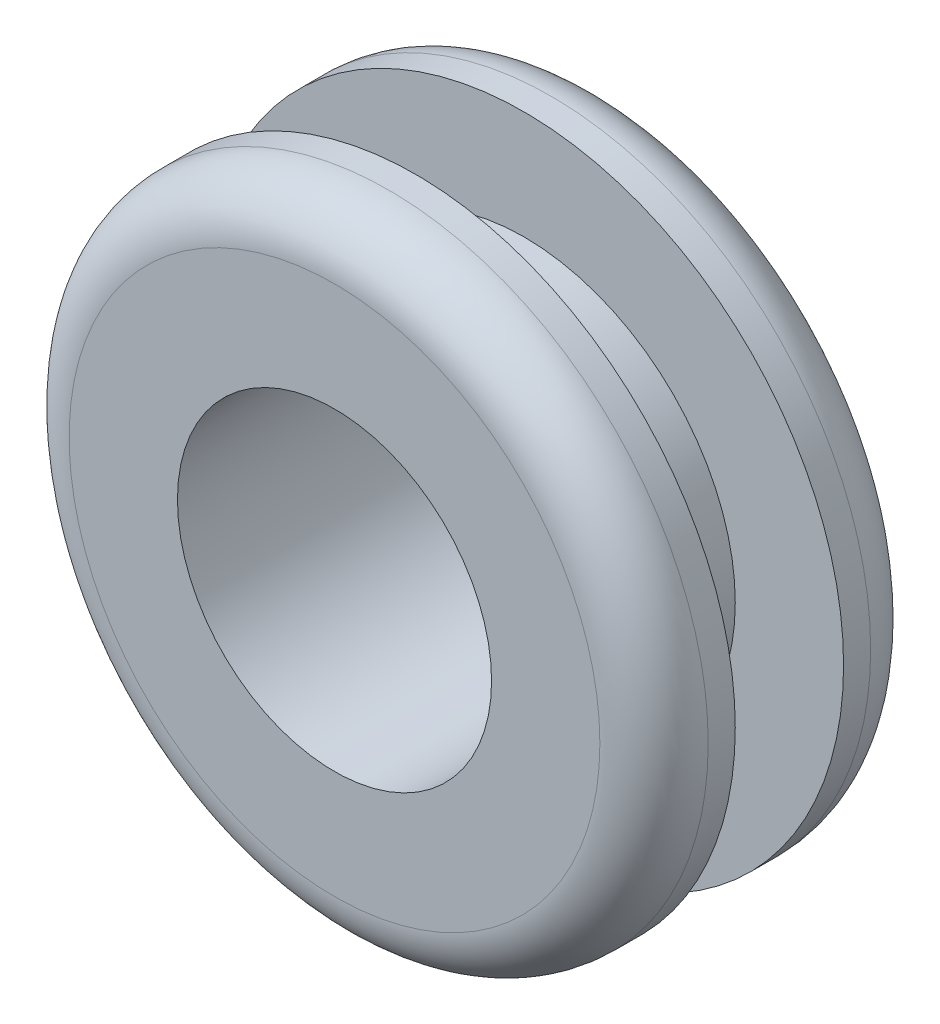
ISO-10303-21;
HEADER;
FILE_DESCRIPTION(('STEP AP214'),'2;1');
FILE_NAME('part.step','',(''),(''),'','','');
FILE_SCHEMA(('AUTOMOTIVE_DESIGN { 1 0 10303 214 1 1 1 1 }'));
ENDSEC;
DATA;
#1=APPLICATION_CONTEXT('core data for automotive mechanical design processes');
#2=APPLICATION_PROTOCOL_DEFINITION('international standard','automotive_design',2000,#1);
#3=PRODUCT_CONTEXT('',#1,'mechanical');
#4=PRODUCT('Part','Part','',(#3));
#5=PRODUCT_RELATED_PRODUCT_CATEGORY('part','',(#4));
#6=PRODUCT_DEFINITION_FORMATION('','',#4);
#7=PRODUCT_DEFINITION_CONTEXT('part definition',#1,'design');
#8=PRODUCT_DEFINITION('design','',#6,#7);
#9=PRODUCT_DEFINITION_SHAPE('','',#8);
#10=(LENGTH_UNIT() NAMED_UNIT(*) SI_UNIT(.MILLI.,.METRE.));
#11=(NAMED_UNIT(*) PLANE_ANGLE_UNIT() SI_UNIT($,.RADIAN.));
#12=(NAMED_UNIT(*) SI_UNIT($,.STERADIAN.) SOLID_ANGLE_UNIT());
#13=UNCERTAINTY_MEASURE_WITH_UNIT(LENGTH_MEASURE(1.E-05),#10,'distance_accuracy_value','');
#14=(GEOMETRIC_REPRESENTATION_CONTEXT(3) GLOBAL_UNCERTAINTY_ASSIGNED_CONTEXT((#13)) GLOBAL_UNIT_ASSIGNED_CONTEXT((#10,
#11,#12)) REPRESENTATION_CONTEXT('',''));
#15=CARTESIAN_POINT('',(0.,0.,0.));
#16=DIRECTION('',(0.,0.,1.));
#17=DIRECTION('',(1.,0.,0.));
#18=AXIS2_PLACEMENT_3D('',#15,#16,#17);
#19=CARTESIAN_POINT('',(-4.9,0.,2.50000000000001));
#20=DIRECTION('',(0.,0.,-1.));
#21=DIRECTION('',(-1.,0.,0.));
#22=AXIS2_PLACEMENT_3D('',#19,#20,#21);
#23=PLANE('',#22);
#24=CARTESIAN_POINT('',(0.,0.,2.50000000000001));
#25=DIRECTION('',(0.,0.,1.));
#26=DIRECTION('',(1.,0.,0.));
#27=AXIS2_PLACEMENT_3D('',#24,#25,#26);
#28=CIRCLE('',#27,2.89999999999999);
#29=CARTESIAN_POINT('',(2.89999999999999,0.,2.50000000000001));
#30=VERTEX_POINT('',#29);
#31=EDGE_CURVE('E10',#30,#30,#28,.T.);
#32=ORIENTED_EDGE('',*,*,#31,.F.);
#33=EDGE_LOOP('',(#32));
#34=FACE_BOUND('',#33,.T.);
#35=CARTESIAN_POINT('',(0.,0.,2.50000000000001));
#36=DIRECTION('',(0.,0.,1.));
#37=DIRECTION('',(1.,0.,0.));
#38=AXIS2_PLACEMENT_3D('',#35,#36,#37);
#39=CIRCLE('',#38,4.9);
#40=CARTESIAN_POINT('',(4.9,0.,2.50000000000001));
#41=VERTEX_POINT('',#40);
#42=EDGE_CURVE('E80',#41,#41,#39,.T.);
#43=ORIENTED_EDGE('',*,*,#42,.T.);
#44=EDGE_LOOP('',(#43));
#45=FACE_BOUND('',#44,.T.);
#46=ADVANCED_FACE('F37',(#34,#45),#23,.F.);
#47=CARTESIAN_POINT('',(0.,0.,0.));
#48=DIRECTION('',(0.,0.,1.));
#49=DIRECTION('',(1.,0.,0.));
#50=AXIS2_PLACEMENT_3D('',#47,#48,#49);
#51=CYLINDRICAL_SURFACE('',#50,2.9);
#52=CARTESIAN_POINT('',(0.,0.,-2.49999999999999));
#53=DIRECTION('',(0.,0.,1.));
#54=DIRECTION('',(1.,0.,0.));
#55=AXIS2_PLACEMENT_3D('',#52,#53,#54);
#56=CIRCLE('',#55,2.90000000000001);
#57=CARTESIAN_POINT('',(2.90000000000001,0.,-2.49999999999999));
#58=VERTEX_POINT('',#57);
#59=EDGE_CURVE('E44',#58,#58,#56,.T.);
#60=ORIENTED_EDGE('',*,*,#59,.F.);
#61=EDGE_LOOP('',(#60));
#62=FACE_BOUND('',#61,.T.);
#63=ORIENTED_EDGE('',*,*,#31,.T.);
#64=EDGE_LOOP('',(#63));
#65=FACE_BOUND('',#64,.T.);
#66=ADVANCED_FACE('F130',(#62,#65),#51,.F.);
#67=CARTESIAN_POINT('',(-2.90000000000001,0.,-2.5));
#68=DIRECTION('',(0.,0.,1.));
#69=DIRECTION('',(1.,0.,0.));
#70=AXIS2_PLACEMENT_3D('',#67,#68,#69);
#71=PLANE('',#70);
#72=CARTESIAN_POINT('',(0.,0.,-2.5));
#73=DIRECTION('',(0.,0.,1.));
#74=DIRECTION('',(1.,0.,0.));
#75=AXIS2_PLACEMENT_3D('',#72,#73,#74);
#76=CIRCLE('',#75,4.9);
#77=CARTESIAN_POINT('',(4.9,0.,-2.5));
#78=VERTEX_POINT('',#77);
#79=EDGE_CURVE('E49',#78,#78,#76,.T.);
#80=ORIENTED_EDGE('',*,*,#79,.F.);
#81=EDGE_LOOP('',(#80));
#82=FACE_BOUND('',#81,.T.);
#83=ORIENTED_EDGE('',*,*,#59,.T.);
#84=EDGE_LOOP('',(#83));
#85=FACE_BOUND('',#84,.T.);
#86=ADVANCED_FACE('F125',(#82,#85),#71,.F.);
#87=CARTESIAN_POINT('',(0.,0.,-1.49999999999998));
#88=DIRECTION('',(0.,0.,1.));
#89=DIRECTION('',(1.,0.,0.));
#90=AXIS2_PLACEMENT_3D('',#87,#88,#89);
#91=TOROIDAL_SURFACE('',#90,4.90000000000001,1.);
#92=CARTESIAN_POINT('',(0.,0.,-1.5));
#93=DIRECTION('',(0.,0.,1.));
#94=DIRECTION('',(1.,0.,0.));
#95=AXIS2_PLACEMENT_3D('',#92,#93,#94);
#96=CIRCLE('',#95,5.90000000000001);
#97=CARTESIAN_POINT('',(5.90000000000001,0.,-1.5));
#98=VERTEX_POINT('',#97);
#99=EDGE_CURVE('E54',#98,#98,#96,.T.);
#100=ORIENTED_EDGE('',*,*,#99,.F.);
#101=EDGE_LOOP('',(#100));
#102=FACE_BOUND('',#101,.T.);
#103=ORIENTED_EDGE('',*,*,#79,.T.);
#104=EDGE_LOOP('',(#103));
#105=FACE_BOUND('',#104,.T.);
#106=ADVANCED_FACE('F119',(#102,#105),#91,.T.);
#107=CARTESIAN_POINT('',(0.,0.,0.));
#108=DIRECTION('',(0.,0.,1.));
#109=DIRECTION('',(1.,0.,0.));
#110=AXIS2_PLACEMENT_3D('',#107,#108,#109);
#111=CYLINDRICAL_SURFACE('',#110,5.9);
#112=CARTESIAN_POINT('',(0.,0.,-0.999999999999979));
#113=DIRECTION('',(0.,0.,1.));
#114=DIRECTION('',(1.,0.,0.));
#115=AXIS2_PLACEMENT_3D('',#112,#113,#114);
#116=CIRCLE('',#115,5.9);
#117=CARTESIAN_POINT('',(5.9,0.,-0.999999999999979));
#118=VERTEX_POINT('',#117);
#119=EDGE_CURVE('E60',#118,#118,#116,.T.);
#120=ORIENTED_EDGE('',*,*,#119,.F.);
#121=EDGE_LOOP('',(#120));
#122=FACE_BOUND('',#121,.T.);
#123=ORIENTED_EDGE('',*,*,#99,.T.);
#124=EDGE_LOOP('',(#123));
#125=FACE_BOUND('',#124,.T.);
#126=ADVANCED_FACE('F113',(#122,#125),#111,.T.);
#127=CARTESIAN_POINT('',(-5.9,0.,-0.999999999999983));
#128=DIRECTION('',(0.,0.,-1.));
#129=DIRECTION('',(-1.,0.,0.));
#130=AXIS2_PLACEMENT_3D('',#127,#128,#129);
#131=PLANE('',#130);
#132=CARTESIAN_POINT('',(0.,0.,-0.999999999999986));
#133=DIRECTION('',(0.,0.,1.));
#134=DIRECTION('',(1.,0.,0.));
#135=AXIS2_PLACEMENT_3D('',#132,#133,#134);
#136=CIRCLE('',#135,3.90000000000001);
#137=CARTESIAN_POINT('',(3.90000000000001,0.,-0.999999999999986));
#138=VERTEX_POINT('',#137);
#139=EDGE_CURVE('E64',#138,#138,#136,.T.);
#140=ORIENTED_EDGE('',*,*,#139,.F.);
#141=EDGE_LOOP('',(#140));
#142=FACE_BOUND('',#141,.T.);
#143=ORIENTED_EDGE('',*,*,#119,.T.);
#144=EDGE_LOOP('',(#143));
#145=FACE_BOUND('',#144,.T.);
#146=ADVANCED_FACE('F107',(#142,#145),#131,.F.);
#147=CARTESIAN_POINT('',(0.,0.,0.));
#148=DIRECTION('',(0.,0.,1.));
#149=DIRECTION('',(1.,0.,0.));
#150=AXIS2_PLACEMENT_3D('',#147,#148,#149);
#151=CYLINDRICAL_SURFACE('',#150,3.9);
#152=CARTESIAN_POINT('',(0.,0.,1.00000000000001));
#153=DIRECTION('',(0.,0.,1.));
#154=DIRECTION('',(1.,0.,0.));
#155=AXIS2_PLACEMENT_3D('',#152,#153,#154);
#156=CIRCLE('',#155,3.9);
#157=CARTESIAN_POINT('',(3.9,0.,1.00000000000001));
#158=VERTEX_POINT('',#157);
#159=EDGE_CURVE('E68',#158,#158,#156,.T.);
#160=ORIENTED_EDGE('',*,*,#159,.F.);
#161=EDGE_LOOP('',(#160));
#162=FACE_BOUND('',#161,.T.);
#163=ORIENTED_EDGE('',*,*,#139,.T.);
#164=EDGE_LOOP('',(#163));
#165=FACE_BOUND('',#164,.T.);
#166=ADVANCED_FACE('F101',(#162,#165),#151,.T.);
#167=CARTESIAN_POINT('',(-3.9,0.,1.00000000000001));
#168=DIRECTION('',(0.,0.,1.));
#169=DIRECTION('',(1.,0.,0.));
#170=AXIS2_PLACEMENT_3D('',#167,#168,#169);
#171=PLANE('',#170);
#172=CARTESIAN_POINT('',(0.,0.,1.00000000000001));
#173=DIRECTION('',(0.,0.,1.));
#174=DIRECTION('',(1.,0.,0.));
#175=AXIS2_PLACEMENT_3D('',#172,#173,#174);
#176=CIRCLE('',#175,5.9);
#177=CARTESIAN_POINT('',(5.9,0.,1.00000000000001));
#178=VERTEX_POINT('',#177);
#179=EDGE_CURVE('E72',#178,#178,#176,.T.);
#180=ORIENTED_EDGE('',*,*,#179,.F.);
#181=EDGE_LOOP('',(#180));
#182=FACE_BOUND('',#181,.T.);
#183=ORIENTED_EDGE('',*,*,#159,.T.);
#184=EDGE_LOOP('',(#183));
#185=FACE_BOUND('',#184,.T.);
#186=ADVANCED_FACE('F95',(#182,#185),#171,.F.);
#187=CARTESIAN_POINT('',(0.,0.,0.));
#188=DIRECTION('',(0.,0.,1.));
#189=DIRECTION('',(1.,0.,0.));
#190=AXIS2_PLACEMENT_3D('',#187,#188,#189);
#191=CYLINDRICAL_SURFACE('',#190,5.9);
#192=CARTESIAN_POINT('',(0.,0.,1.5));
#193=DIRECTION('',(0.,0.,1.));
#194=DIRECTION('',(1.,0.,0.));
#195=AXIS2_PLACEMENT_3D('',#192,#193,#194);
#196=CIRCLE('',#195,5.9);
#197=CARTESIAN_POINT('',(5.9,0.,1.5));
#198=VERTEX_POINT('',#197);
#199=EDGE_CURVE('E76',#198,#198,#196,.T.);
#200=ORIENTED_EDGE('',*,*,#199,.F.);
#201=EDGE_LOOP('',(#200));
#202=FACE_BOUND('',#201,.T.);
#203=ORIENTED_EDGE('',*,*,#179,.T.);
#204=EDGE_LOOP('',(#203));
#205=FACE_BOUND('',#204,.T.);
#206=ADVANCED_FACE('F89',(#202,#205),#191,.T.);
#207=CARTESIAN_POINT('',(0.,0.,1.50000000000002));
#208=DIRECTION('',(0.,0.,1.));
#209=DIRECTION('',(1.,0.,0.));
#210=AXIS2_PLACEMENT_3D('',#207,#208,#209);
#211=TOROIDAL_SURFACE('',#210,4.9,0.999999999999995);
#212=ORIENTED_EDGE('',*,*,#42,.F.);
#213=EDGE_LOOP('',(#212));
#214=FACE_BOUND('',#213,.T.);
#215=ORIENTED_EDGE('',*,*,#199,.T.);
#216=EDGE_LOOP('',(#215));
#217=FACE_BOUND('',#216,.T.);
#218=ADVANCED_FACE('F86',(#214,#217),#211,.T.);
#219=CLOSED_SHELL('',(#46,#66,#86,#106,#126,#146,#166,#186,#206,#218));
#220=MANIFOLD_SOLID_BREP('B2',#219);
#221=ADVANCED_BREP_SHAPE_REPRESENTATION('',(#18,#220),#14);
#222=SHAPE_DEFINITION_REPRESENTATION(#9,#221);
ENDSEC;
END-ISO-10303-21;
